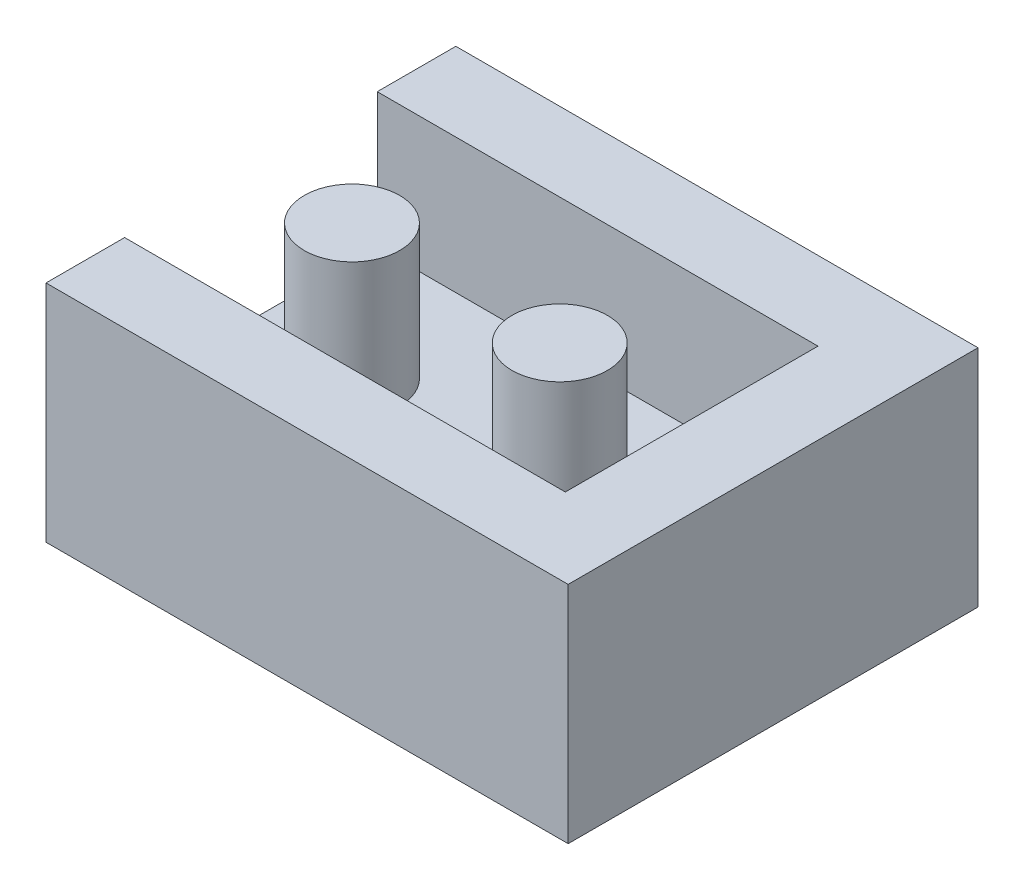
ISO-10303-21;
HEADER;
FILE_DESCRIPTION(('STEP AP214'),'2;1');
FILE_NAME('part.step','',(''),(''),'','','');
FILE_SCHEMA(('AUTOMOTIVE_DESIGN { 1 0 10303 214 1 1 1 1 }'));
ENDSEC;
DATA;
#1=APPLICATION_CONTEXT('core data for automotive mechanical design processes');
#2=APPLICATION_PROTOCOL_DEFINITION('international standard','automotive_design',2000,#1);
#3=PRODUCT_CONTEXT('',#1,'mechanical');
#4=PRODUCT('Part','Part','',(#3));
#5=PRODUCT_RELATED_PRODUCT_CATEGORY('part','',(#4));
#6=PRODUCT_DEFINITION_FORMATION('','',#4);
#7=PRODUCT_DEFINITION_CONTEXT('part definition',#1,'design');
#8=PRODUCT_DEFINITION('design','',#6,#7);
#9=PRODUCT_DEFINITION_SHAPE('','',#8);
#10=(LENGTH_UNIT() NAMED_UNIT(*) SI_UNIT(.MILLI.,.METRE.));
#11=(NAMED_UNIT(*) PLANE_ANGLE_UNIT() SI_UNIT($,.RADIAN.));
#12=(NAMED_UNIT(*) SI_UNIT($,.STERADIAN.) SOLID_ANGLE_UNIT());
#13=UNCERTAINTY_MEASURE_WITH_UNIT(LENGTH_MEASURE(1.E-05),#10,'distance_accuracy_value','');
#14=(GEOMETRIC_REPRESENTATION_CONTEXT(3) GLOBAL_UNCERTAINTY_ASSIGNED_CONTEXT((#13)) GLOBAL_UNIT_ASSIGNED_CONTEXT((#10,
#11,#12)) REPRESENTATION_CONTEXT('',''));
#15=CARTESIAN_POINT('',(0.,0.,0.));
#16=DIRECTION('',(0.,0.,1.));
#17=DIRECTION('',(1.,0.,0.));
#18=AXIS2_PLACEMENT_3D('',#15,#16,#17);
#19=CARTESIAN_POINT('',(0.,3.2,0.));
#20=DIRECTION('',(0.,1.,0.));
#21=DIRECTION('',(0.,0.,1.));
#22=AXIS2_PLACEMENT_3D('',#19,#20,#21);
#23=PLANE('',#22);
#24=CARTESIAN_POINT('',(1.7,3.2,0.));
#25=DIRECTION('',(0.,1.,0.));
#26=DIRECTION('',(0.,0.,1.));
#27=AXIS2_PLACEMENT_3D('',#24,#25,#26);
#28=CIRCLE('',#27,1.7);
#29=CARTESIAN_POINT('',(1.7,3.2,1.7));
#30=VERTEX_POINT('',#29);
#31=EDGE_CURVE('E184',#30,#30,#28,.T.);
#32=ORIENTED_EDGE('',*,*,#31,.F.);
#33=EDGE_LOOP('',(#32));
#34=FACE_BOUND('',#33,.T.);
#35=CARTESIAN_POINT('',(-5.7,3.2,0.));
#36=DIRECTION('',(0.,1.,0.));
#37=DIRECTION('',(0.,0.,1.));
#38=AXIS2_PLACEMENT_3D('',#35,#36,#37);
#39=CIRCLE('',#38,1.7);
#40=CARTESIAN_POINT('',(-5.7,3.2,1.7));
#41=VERTEX_POINT('',#40);
#42=EDGE_CURVE('E194',#41,#41,#39,.T.);
#43=ORIENTED_EDGE('',*,*,#42,.F.);
#44=EDGE_LOOP('',(#43));
#45=FACE_BOUND('',#44,.T.);
#46=DIRECTION('',(0.,0.,1.));
#47=VECTOR('',#46,1.);
#48=CARTESIAN_POINT('',(6.4,3.2,0.));
#49=LINE('',#48,#47);
#50=CARTESIAN_POINT('',(6.4,3.2,-4.5));
#51=VERTEX_POINT('',#50);
#52=CARTESIAN_POINT('',(6.4,3.2,4.5));
#53=VERTEX_POINT('',#52);
#54=EDGE_CURVE('E239',#51,#53,#49,.T.);
#55=ORIENTED_EDGE('',*,*,#54,.F.);
#56=DIRECTION('',(1.,0.,0.));
#57=VECTOR('',#56,1.);
#58=CARTESIAN_POINT('',(0.,3.2,-4.5));
#59=LINE('',#58,#57);
#60=CARTESIAN_POINT('',(-9.3,3.2,-4.5));
#61=VERTEX_POINT('',#60);
#62=EDGE_CURVE('E237',#61,#51,#59,.T.);
#63=ORIENTED_EDGE('',*,*,#62,.F.);
#64=DIRECTION('',(0.,0.,-1.));
#65=VECTOR('',#64,1.);
#66=CARTESIAN_POINT('',(-9.3,3.2,0.));
#67=LINE('',#66,#65);
#68=CARTESIAN_POINT('',(-9.3,3.2,4.5));
#69=VERTEX_POINT('',#68);
#70=EDGE_CURVE('E183',#69,#61,#67,.T.);
#71=ORIENTED_EDGE('',*,*,#70,.F.);
#72=DIRECTION('',(-1.,0.,0.));
#73=VECTOR('',#72,1.);
#74=CARTESIAN_POINT('',(0.,3.2,4.5));
#75=LINE('',#74,#73);
#76=EDGE_CURVE('E177',#53,#69,#75,.T.);
#77=ORIENTED_EDGE('',*,*,#76,.F.);
#78=EDGE_LOOP('',(#55,#63,#71,#77));
#79=FACE_BOUND('',#78,.T.);
#80=ADVANCED_FACE('F93',(#34,#45,#79),#23,.T.);
#81=CARTESIAN_POINT('',(0.,3.2,7.30000000000001));
#82=DIRECTION('',(0.,0.,-1.));
#83=DIRECTION('',(-1.,0.,0.));
#84=AXIS2_PLACEMENT_3D('',#81,#82,#83);
#85=PLANE('',#84);
#86=DIRECTION('',(1.,0.,0.));
#87=VECTOR('',#86,1.);
#88=CARTESIAN_POINT('',(0.,0.,7.30000000000001));
#89=LINE('',#88,#87);
#90=CARTESIAN_POINT('',(-9.3,0.,7.30000000000001));
#91=VERTEX_POINT('',#90);
#92=CARTESIAN_POINT('',(9.3,0.,7.3));
#93=VERTEX_POINT('',#92);
#94=EDGE_CURVE('E199',#91,#93,#89,.T.);
#95=ORIENTED_EDGE('',*,*,#94,.T.);
#96=DIRECTION('',(0.,-1.,0.));
#97=VECTOR('',#96,1.);
#98=CARTESIAN_POINT('',(9.3,3.2,7.3));
#99=LINE('',#98,#97);
#100=CARTESIAN_POINT('',(9.3,8.,7.3));
#101=VERTEX_POINT('',#100);
#102=EDGE_CURVE('E12',#101,#93,#99,.T.);
#103=ORIENTED_EDGE('',*,*,#102,.F.);
#104=DIRECTION('',(1.,0.,0.));
#105=VECTOR('',#104,1.);
#106=CARTESIAN_POINT('',(0.,8.,7.30000000000001));
#107=LINE('',#106,#105);
#108=CARTESIAN_POINT('',(-9.3,8.,7.30000000000001));
#109=VERTEX_POINT('',#108);
#110=EDGE_CURVE('E225',#109,#101,#107,.T.);
#111=ORIENTED_EDGE('',*,*,#110,.F.);
#112=DIRECTION('',(0.,-1.,0.));
#113=VECTOR('',#112,1.);
#114=CARTESIAN_POINT('',(-9.3,3.2,7.30000000000001));
#115=LINE('',#114,#113);
#116=EDGE_CURVE('E108',#109,#91,#115,.T.);
#117=ORIENTED_EDGE('',*,*,#116,.T.);
#118=EDGE_LOOP('',(#95,#103,#111,#117));
#119=FACE_BOUND('',#118,.T.);
#120=ADVANCED_FACE('F95',(#119),#85,.F.);
#121=CARTESIAN_POINT('',(9.3,3.2,0.));
#122=DIRECTION('',(-1.,0.,0.));
#123=DIRECTION('',(0.,0.,1.));
#124=AXIS2_PLACEMENT_3D('',#121,#122,#123);
#125=PLANE('',#124);
#126=DIRECTION('',(0.,0.,-1.));
#127=VECTOR('',#126,1.);
#128=CARTESIAN_POINT('',(9.3,0.,0.));
#129=LINE('',#128,#127);
#130=CARTESIAN_POINT('',(9.3,0.,-7.3));
#131=VERTEX_POINT('',#130);
#132=EDGE_CURVE('E205',#93,#131,#129,.T.);
#133=ORIENTED_EDGE('',*,*,#132,.T.);
#134=DIRECTION('',(0.,-1.,0.));
#135=VECTOR('',#134,1.);
#136=CARTESIAN_POINT('',(9.3,3.2,-7.3));
#137=LINE('',#136,#135);
#138=CARTESIAN_POINT('',(9.3,8.,-7.3));
#139=VERTEX_POINT('',#138);
#140=EDGE_CURVE('E101',#139,#131,#137,.T.);
#141=ORIENTED_EDGE('',*,*,#140,.F.);
#142=DIRECTION('',(0.,0.,-1.));
#143=VECTOR('',#142,1.);
#144=CARTESIAN_POINT('',(9.3,8.,0.));
#145=LINE('',#144,#143);
#146=EDGE_CURVE('E230',#101,#139,#145,.T.);
#147=ORIENTED_EDGE('',*,*,#146,.F.);
#148=ORIENTED_EDGE('',*,*,#102,.T.);
#149=EDGE_LOOP('',(#133,#141,#147,#148));
#150=FACE_BOUND('',#149,.T.);
#151=ADVANCED_FACE('F218',(#150),#125,.F.);
#152=CARTESIAN_POINT('',(0.,3.2,-7.3));
#153=DIRECTION('',(0.,0.,-1.));
#154=DIRECTION('',(-1.,0.,0.));
#155=AXIS2_PLACEMENT_3D('',#152,#153,#154);
#156=PLANE('',#155);
#157=DIRECTION('',(1.,0.,0.));
#158=VECTOR('',#157,1.);
#159=CARTESIAN_POINT('',(0.,0.,-7.3));
#160=LINE('',#159,#158);
#161=CARTESIAN_POINT('',(-9.3,0.,-7.3));
#162=VERTEX_POINT('',#161);
#163=EDGE_CURVE('E208',#162,#131,#160,.T.);
#164=ORIENTED_EDGE('',*,*,#163,.F.);
#165=DIRECTION('',(0.,-1.,0.));
#166=VECTOR('',#165,1.);
#167=CARTESIAN_POINT('',(-9.3,3.2,-7.3));
#168=LINE('',#167,#166);
#169=CARTESIAN_POINT('',(-9.3,8.,-7.3));
#170=VERTEX_POINT('',#169);
#171=EDGE_CURVE('E116',#170,#162,#168,.T.);
#172=ORIENTED_EDGE('',*,*,#171,.F.);
#173=DIRECTION('',(-1.,0.,0.));
#174=VECTOR('',#173,1.);
#175=CARTESIAN_POINT('',(0.,8.,-7.3));
#176=LINE('',#175,#174);
#177=EDGE_CURVE('E176',#139,#170,#176,.T.);
#178=ORIENTED_EDGE('',*,*,#177,.F.);
#179=ORIENTED_EDGE('',*,*,#140,.T.);
#180=EDGE_LOOP('',(#164,#172,#178,#179));
#181=FACE_BOUND('',#180,.T.);
#182=ADVANCED_FACE('F215',(#181),#156,.T.);
#183=CARTESIAN_POINT('',(-9.3,3.2,0.));
#184=DIRECTION('',(-1.,0.,0.));
#185=DIRECTION('',(0.,0.,1.));
#186=AXIS2_PLACEMENT_3D('',#183,#184,#185);
#187=PLANE('',#186);
#188=DIRECTION('',(0.,0.,-1.));
#189=VECTOR('',#188,1.);
#190=CARTESIAN_POINT('',(-9.3,0.,0.));
#191=LINE('',#190,#189);
#192=EDGE_CURVE('E203',#91,#162,#191,.T.);
#193=ORIENTED_EDGE('',*,*,#192,.F.);
#194=ORIENTED_EDGE('',*,*,#116,.F.);
#195=DIRECTION('',(0.,0.,1.));
#196=VECTOR('',#195,1.);
#197=CARTESIAN_POINT('',(-9.3,8.,0.));
#198=LINE('',#197,#196);
#199=CARTESIAN_POINT('',(-9.3,8.,4.5));
#200=VERTEX_POINT('',#199);
#201=EDGE_CURVE('E223',#200,#109,#198,.T.);
#202=ORIENTED_EDGE('',*,*,#201,.F.);
#203=DIRECTION('',(0.,-1.,0.));
#204=VECTOR('',#203,1.);
#205=CARTESIAN_POINT('',(-9.3,8.,4.5));
#206=LINE('',#205,#204);
#207=EDGE_CURVE('E236',#200,#69,#206,.T.);
#208=ORIENTED_EDGE('',*,*,#207,.T.);
#209=ORIENTED_EDGE('',*,*,#70,.T.);
#210=DIRECTION('',(0.,-1.,0.));
#211=VECTOR('',#210,1.);
#212=CARTESIAN_POINT('',(-9.3,8.,-4.5));
#213=LINE('',#212,#211);
#214=CARTESIAN_POINT('',(-9.3,8.,-4.5));
#215=VERTEX_POINT('',#214);
#216=EDGE_CURVE('E163',#215,#61,#213,.T.);
#217=ORIENTED_EDGE('',*,*,#216,.F.);
#218=DIRECTION('',(0.,0.,1.));
#219=VECTOR('',#218,1.);
#220=CARTESIAN_POINT('',(-9.3,8.,0.));
#221=LINE('',#220,#219);
#222=EDGE_CURVE('E170',#170,#215,#221,.T.);
#223=ORIENTED_EDGE('',*,*,#222,.F.);
#224=ORIENTED_EDGE('',*,*,#171,.T.);
#225=EDGE_LOOP('',(#193,#194,#202,#208,#209,#217,#223,#224));
#226=FACE_BOUND('',#225,.T.);
#227=ADVANCED_FACE('F180',(#226),#187,.T.);
#228=CARTESIAN_POINT('',(0.,0.,0.));
#229=DIRECTION('',(0.,1.,0.));
#230=DIRECTION('',(0.,0.,1.));
#231=AXIS2_PLACEMENT_3D('',#228,#229,#230);
#232=PLANE('',#231);
#233=ORIENTED_EDGE('',*,*,#94,.F.);
#234=ORIENTED_EDGE('',*,*,#192,.T.);
#235=ORIENTED_EDGE('',*,*,#163,.T.);
#236=ORIENTED_EDGE('',*,*,#132,.F.);
#237=EDGE_LOOP('',(#233,#234,#235,#236));
#238=FACE_BOUND('',#237,.T.);
#239=ADVANCED_FACE('F220',(#238),#232,.F.);
#240=CARTESIAN_POINT('',(-5.7,8.,0.));
#241=DIRECTION('',(0.,-1.,0.));
#242=DIRECTION('',(0.,0.,-1.));
#243=AXIS2_PLACEMENT_3D('',#240,#241,#242);
#244=CYLINDRICAL_SURFACE('',#243,1.7);
#245=CARTESIAN_POINT('',(-5.7,8.,0.));
#246=DIRECTION('',(0.,1.,0.));
#247=DIRECTION('',(0.,0.,1.));
#248=AXIS2_PLACEMENT_3D('',#245,#246,#247);
#249=CIRCLE('',#248,1.7);
#250=CARTESIAN_POINT('',(-5.7,8.,1.7));
#251=VERTEX_POINT('',#250);
#252=EDGE_CURVE('E196',#251,#251,#249,.T.);
#253=ORIENTED_EDGE('',*,*,#252,.F.);
#254=EDGE_LOOP('',(#253));
#255=FACE_BOUND('',#254,.T.);
#256=ORIENTED_EDGE('',*,*,#42,.T.);
#257=EDGE_LOOP('',(#256));
#258=FACE_BOUND('',#257,.T.);
#259=ADVANCED_FACE('F271',(#255,#258),#244,.T.);
#260=CARTESIAN_POINT('',(0.,8.,0.));
#261=DIRECTION('',(0.,1.,0.));
#262=DIRECTION('',(0.,0.,1.));
#263=AXIS2_PLACEMENT_3D('',#260,#261,#262);
#264=PLANE('',#263);
#265=ORIENTED_EDGE('',*,*,#252,.T.);
#266=EDGE_LOOP('',(#265));
#267=FACE_BOUND('',#266,.T.);
#268=ADVANCED_FACE('F301',(#267),#264,.T.);
#269=CARTESIAN_POINT('',(1.7,8.,0.));
#270=DIRECTION('',(0.,-1.,0.));
#271=DIRECTION('',(0.,0.,-1.));
#272=AXIS2_PLACEMENT_3D('',#269,#270,#271);
#273=CYLINDRICAL_SURFACE('',#272,1.7);
#274=CARTESIAN_POINT('',(1.7,8.,0.));
#275=DIRECTION('',(0.,1.,0.));
#276=DIRECTION('',(0.,0.,1.));
#277=AXIS2_PLACEMENT_3D('',#274,#275,#276);
#278=CIRCLE('',#277,1.7);
#279=CARTESIAN_POINT('',(1.7,8.,1.7));
#280=VERTEX_POINT('',#279);
#281=EDGE_CURVE('E187',#280,#280,#278,.T.);
#282=ORIENTED_EDGE('',*,*,#281,.F.);
#283=EDGE_LOOP('',(#282));
#284=FACE_BOUND('',#283,.T.);
#285=ORIENTED_EDGE('',*,*,#31,.T.);
#286=EDGE_LOOP('',(#285));
#287=FACE_BOUND('',#286,.T.);
#288=ADVANCED_FACE('F308',(#284,#287),#273,.T.);
#289=CARTESIAN_POINT('',(0.,8.,0.));
#290=DIRECTION('',(0.,1.,0.));
#291=DIRECTION('',(0.,0.,1.));
#292=AXIS2_PLACEMENT_3D('',#289,#290,#291);
#293=PLANE('',#292);
#294=ORIENTED_EDGE('',*,*,#281,.T.);
#295=EDGE_LOOP('',(#294));
#296=FACE_BOUND('',#295,.T.);
#297=ADVANCED_FACE('F259',(#296),#293,.T.);
#298=CARTESIAN_POINT('',(0.,8.,-4.5));
#299=DIRECTION('',(0.,0.,-1.));
#300=DIRECTION('',(-1.,0.,0.));
#301=AXIS2_PLACEMENT_3D('',#298,#299,#300);
#302=PLANE('',#301);
#303=ORIENTED_EDGE('',*,*,#62,.T.);
#304=DIRECTION('',(0.,-1.,0.));
#305=VECTOR('',#304,1.);
#306=CARTESIAN_POINT('',(6.4,8.,-4.5));
#307=LINE('',#306,#305);
#308=CARTESIAN_POINT('',(6.4,8.,-4.5));
#309=VERTEX_POINT('',#308);
#310=EDGE_CURVE('E166',#309,#51,#307,.T.);
#311=ORIENTED_EDGE('',*,*,#310,.F.);
#312=DIRECTION('',(1.,0.,0.));
#313=VECTOR('',#312,1.);
#314=CARTESIAN_POINT('',(0.,8.,-4.5));
#315=LINE('',#314,#313);
#316=EDGE_CURVE('E159',#215,#309,#315,.T.);
#317=ORIENTED_EDGE('',*,*,#316,.F.);
#318=ORIENTED_EDGE('',*,*,#216,.T.);
#319=EDGE_LOOP('',(#303,#311,#317,#318));
#320=FACE_BOUND('',#319,.T.);
#321=ADVANCED_FACE('F161',(#320),#302,.F.);
#322=CARTESIAN_POINT('',(6.4,8.,0.));
#323=DIRECTION('',(1.,0.,0.));
#324=DIRECTION('',(0.,0.,-1.));
#325=AXIS2_PLACEMENT_3D('',#322,#323,#324);
#326=PLANE('',#325);
#327=ORIENTED_EDGE('',*,*,#54,.T.);
#328=DIRECTION('',(0.,-1.,0.));
#329=VECTOR('',#328,1.);
#330=CARTESIAN_POINT('',(6.4,8.,4.5));
#331=LINE('',#330,#329);
#332=CARTESIAN_POINT('',(6.4,8.,4.5));
#333=VERTEX_POINT('',#332);
#334=EDGE_CURVE('E189',#333,#53,#331,.T.);
#335=ORIENTED_EDGE('',*,*,#334,.F.);
#336=DIRECTION('',(0.,0.,1.));
#337=VECTOR('',#336,1.);
#338=CARTESIAN_POINT('',(6.4,8.,0.));
#339=LINE('',#338,#337);
#340=EDGE_CURVE('E169',#309,#333,#339,.T.);
#341=ORIENTED_EDGE('',*,*,#340,.F.);
#342=ORIENTED_EDGE('',*,*,#310,.T.);
#343=EDGE_LOOP('',(#327,#335,#341,#342));
#344=FACE_BOUND('',#343,.T.);
#345=ADVANCED_FACE('F250',(#344),#326,.F.);
#346=CARTESIAN_POINT('',(0.,8.,4.5));
#347=DIRECTION('',(0.,0.,1.));
#348=DIRECTION('',(1.,0.,0.));
#349=AXIS2_PLACEMENT_3D('',#346,#347,#348);
#350=PLANE('',#349);
#351=ORIENTED_EDGE('',*,*,#76,.T.);
#352=ORIENTED_EDGE('',*,*,#207,.F.);
#353=DIRECTION('',(-1.,0.,0.));
#354=VECTOR('',#353,1.);
#355=CARTESIAN_POINT('',(0.,8.,4.5));
#356=LINE('',#355,#354);
#357=EDGE_CURVE('E227',#333,#200,#356,.T.);
#358=ORIENTED_EDGE('',*,*,#357,.F.);
#359=ORIENTED_EDGE('',*,*,#334,.T.);
#360=EDGE_LOOP('',(#351,#352,#358,#359));
#361=FACE_BOUND('',#360,.T.);
#362=ADVANCED_FACE('F246',(#361),#350,.F.);
#363=CARTESIAN_POINT('',(0.,8.,0.));
#364=DIRECTION('',(0.,1.,0.));
#365=DIRECTION('',(0.,0.,1.));
#366=AXIS2_PLACEMENT_3D('',#363,#364,#365);
#367=PLANE('',#366);
#368=ORIENTED_EDGE('',*,*,#222,.T.);
#369=ORIENTED_EDGE('',*,*,#316,.T.);
#370=ORIENTED_EDGE('',*,*,#340,.T.);
#371=ORIENTED_EDGE('',*,*,#357,.T.);
#372=ORIENTED_EDGE('',*,*,#201,.T.);
#373=ORIENTED_EDGE('',*,*,#110,.T.);
#374=ORIENTED_EDGE('',*,*,#146,.T.);
#375=ORIENTED_EDGE('',*,*,#177,.T.);
#376=EDGE_LOOP('',(#368,#369,#370,#371,#372,#373,#374,#375));
#377=FACE_BOUND('',#376,.T.);
#378=ADVANCED_FACE('F173',(#377),#367,.T.);
#379=CLOSED_SHELL('',(#80,#120,#151,#182,#227,#239,#259,#268,#288,#297,#321,#345,#362,#378));
#380=MANIFOLD_SOLID_BREP('B2',#379);
#381=ADVANCED_BREP_SHAPE_REPRESENTATION('',(#18,#380),#14);
#382=SHAPE_DEFINITION_REPRESENTATION(#9,#381);
ENDSEC;
END-ISO-10303-21;
